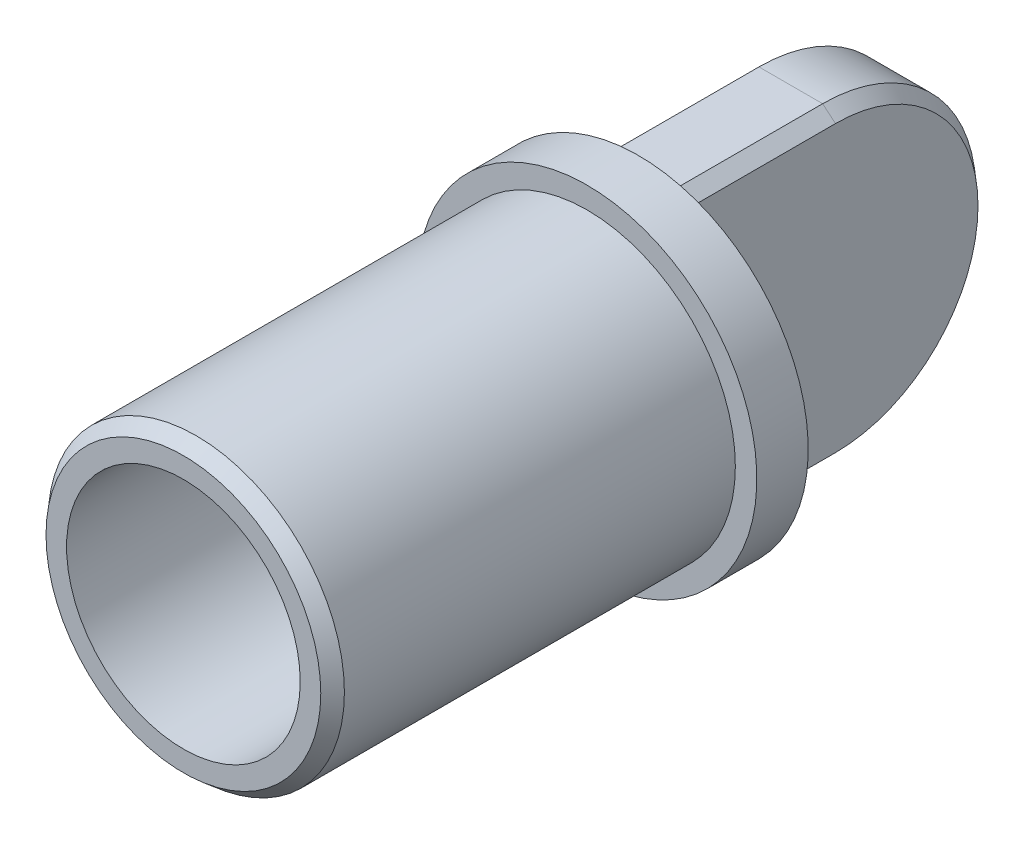
ISO-10303-21;
HEADER;
FILE_DESCRIPTION(('STEP AP214'),'2;1');
FILE_NAME('part.step','',(''),(''),'','','');
FILE_SCHEMA(('AUTOMOTIVE_DESIGN { 1 0 10303 214 1 1 1 1 }'));
ENDSEC;
DATA;
#1=APPLICATION_CONTEXT('core data for automotive mechanical design processes');
#2=APPLICATION_PROTOCOL_DEFINITION('international standard','automotive_design',2000,#1);
#3=PRODUCT_CONTEXT('',#1,'mechanical');
#4=PRODUCT('Part','Part','',(#3));
#5=PRODUCT_RELATED_PRODUCT_CATEGORY('part','',(#4));
#6=PRODUCT_DEFINITION_FORMATION('','',#4);
#7=PRODUCT_DEFINITION_CONTEXT('part definition',#1,'design');
#8=PRODUCT_DEFINITION('design','',#6,#7);
#9=PRODUCT_DEFINITION_SHAPE('','',#8);
#10=(LENGTH_UNIT() NAMED_UNIT(*) SI_UNIT(.MILLI.,.METRE.));
#11=(NAMED_UNIT(*) PLANE_ANGLE_UNIT() SI_UNIT($,.RADIAN.));
#12=(NAMED_UNIT(*) SI_UNIT($,.STERADIAN.) SOLID_ANGLE_UNIT());
#13=UNCERTAINTY_MEASURE_WITH_UNIT(LENGTH_MEASURE(1.E-05),#10,'distance_accuracy_value','');
#14=(GEOMETRIC_REPRESENTATION_CONTEXT(3) GLOBAL_UNCERTAINTY_ASSIGNED_CONTEXT((#13)) GLOBAL_UNIT_ASSIGNED_CONTEXT((#10,
#11,#12)) REPRESENTATION_CONTEXT('',''));
#15=CARTESIAN_POINT('',(0.,0.,0.));
#16=DIRECTION('',(0.,0.,1.));
#17=DIRECTION('',(1.,0.,0.));
#18=AXIS2_PLACEMENT_3D('',#15,#16,#17);
#19=CARTESIAN_POINT('',(0.,0.,30.0829812679553));
#20=DIRECTION('',(0.,0.,-1.));
#21=DIRECTION('',(-1.,0.,0.));
#22=AXIS2_PLACEMENT_3D('',#19,#20,#21);
#23=CYLINDRICAL_SURFACE('',#22,7.32587803050314);
#24=CARTESIAN_POINT('',(0.,0.,29.4479812679553));
#25=DIRECTION('',(0.,0.,1.));
#26=DIRECTION('',(1.,0.,0.));
#27=AXIS2_PLACEMENT_3D('',#24,#25,#26);
#28=CIRCLE('',#27,7.32587803050314);
#29=CARTESIAN_POINT('',(-7.32587803050314,0.,29.4479812679553));
#30=VERTEX_POINT('',#29);
#31=EDGE_CURVE('E11',#30,#30,#28,.F.);
#32=CARTESIAN_POINT('',(0.,0.,10.1185647670471));
#33=DIRECTION('',(0.,0.,-1.));
#34=DIRECTION('',(-1.,0.,0.));
#35=AXIS2_PLACEMENT_3D('',#32,#33,#34);
#36=CIRCLE('',#35,7.32587803050314);
#37=CARTESIAN_POINT('',(-7.32587803050314,0.,10.1185647670471));
#38=VERTEX_POINT('',#37);
#39=EDGE_CURVE('E125',#38,#38,#36,.T.);
#40=CARTESIAN_POINT('',(-7.32587803050314,0.,29.4479812679553));
#41=CARTESIAN_POINT('',(-7.32587803050314,0.,29.2466331794042));
#42=CARTESIAN_POINT('',(-7.32587803050314,0.,29.0452850908531));
#43=CARTESIAN_POINT('',(-7.32587803050314,0.,28.6425889137508));
#44=CARTESIAN_POINT('',(-7.32587803050314,0.,28.4412408251997));
#45=CARTESIAN_POINT('',(-7.32587803050314,0.,28.0385446480974));
#46=CARTESIAN_POINT('',(-7.32587803050314,0.,27.8371965595463));
#47=CARTESIAN_POINT('',(-7.32587803050314,0.,27.434500382444));
#48=CARTESIAN_POINT('',(-7.32587803050314,0.,27.2331522938929));
#49=CARTESIAN_POINT('',(-7.32587803050314,0.,26.8304561167907));
#50=CARTESIAN_POINT('',(-7.32587803050314,0.,26.6291080282395));
#51=CARTESIAN_POINT('',(-7.32587803050314,0.,26.2264118511373));
#52=CARTESIAN_POINT('',(-7.32587803050314,0.,26.0250637625862));
#53=CARTESIAN_POINT('',(-7.32587803050314,0.,25.6223675854839));
#54=CARTESIAN_POINT('',(-7.32587803050314,0.,25.4210194969328));
#55=CARTESIAN_POINT('',(-7.32587803050314,0.,25.0183233198305));
#56=CARTESIAN_POINT('',(-7.32587803050314,0.,24.8169752312794));
#57=CARTESIAN_POINT('',(-7.32587803050314,0.,24.4142790541771));
#58=CARTESIAN_POINT('',(-7.32587803050314,0.,24.212930965626));
#59=CARTESIAN_POINT('',(-7.32587803050314,0.,23.8102347885238));
#60=CARTESIAN_POINT('',(-7.32587803050314,0.,23.6088866999726));
#61=CARTESIAN_POINT('',(-7.32587803050314,0.,23.2061905228704));
#62=CARTESIAN_POINT('',(-7.32587803050314,0.,23.0048424343192));
#63=CARTESIAN_POINT('',(-7.32587803050314,0.,22.602146257217));
#64=CARTESIAN_POINT('',(-7.32587803050314,0.,22.4007981686659));
#65=CARTESIAN_POINT('',(-7.32587803050314,0.,21.9981019915636));
#66=CARTESIAN_POINT('',(-7.32587803050314,0.,21.7967539030125));
#67=CARTESIAN_POINT('',(-7.32587803050314,0.,21.3940577259102));
#68=CARTESIAN_POINT('',(-7.32587803050314,0.,21.1927096373591));
#69=CARTESIAN_POINT('',(-7.32587803050314,0.,20.7900134602568));
#70=CARTESIAN_POINT('',(-7.32587803050314,0.,20.5886653717057));
#71=CARTESIAN_POINT('',(-7.32587803050314,0.,20.1859691946035));
#72=CARTESIAN_POINT('',(-7.32587803050314,0.,19.9846211060523));
#73=CARTESIAN_POINT('',(-7.32587803050314,0.,19.5819249289501));
#74=CARTESIAN_POINT('',(-7.32587803050314,0.,19.3805768403989));
#75=CARTESIAN_POINT('',(-7.32587803050314,0.,18.9778806632967));
#76=CARTESIAN_POINT('',(-7.32587803050314,0.,18.7765325747456));
#77=CARTESIAN_POINT('',(-7.32587803050314,0.,18.3738363976433));
#78=CARTESIAN_POINT('',(-7.32587803050314,0.,18.1724883090922));
#79=CARTESIAN_POINT('',(-7.32587803050314,0.,17.7697921319899));
#80=CARTESIAN_POINT('',(-7.32587803050314,0.,17.5684440434388));
#81=CARTESIAN_POINT('',(-7.32587803050314,0.,17.1657478663365));
#82=CARTESIAN_POINT('',(-7.32587803050314,0.,16.9643997777854));
#83=CARTESIAN_POINT('',(-7.32587803050314,0.,16.5617036006832));
#84=CARTESIAN_POINT('',(-7.32587803050314,0.,16.360355512132));
#85=CARTESIAN_POINT('',(-7.32587803050314,0.,15.9576593350298));
#86=CARTESIAN_POINT('',(-7.32587803050314,0.,15.7563112464786));
#87=CARTESIAN_POINT('',(-7.32587803050314,0.,15.3536150693764));
#88=CARTESIAN_POINT('',(-7.32587803050314,0.,15.1522669808253));
#89=CARTESIAN_POINT('',(-7.32587803050314,0.,14.749570803723));
#90=CARTESIAN_POINT('',(-7.32587803050314,0.,14.5482227151719));
#91=CARTESIAN_POINT('',(-7.32587803050314,0.,14.1455265380696));
#92=CARTESIAN_POINT('',(-7.32587803050314,0.,13.9441784495185));
#93=CARTESIAN_POINT('',(-7.32587803050314,0.,13.5414822724162));
#94=CARTESIAN_POINT('',(-7.32587803050314,0.,13.3401341838651));
#95=CARTESIAN_POINT('',(-7.32587803050314,0.,12.9374380067629));
#96=CARTESIAN_POINT('',(-7.32587803050314,0.,12.7360899182117));
#97=CARTESIAN_POINT('',(-7.32587803050314,0.,12.3333937411095));
#98=CARTESIAN_POINT('',(-7.32587803050314,0.,12.1320456525584));
#99=CARTESIAN_POINT('',(-7.32587803050314,0.,11.7293494754561));
#100=CARTESIAN_POINT('',(-7.32587803050314,0.,11.528001386905));
#101=CARTESIAN_POINT('',(-7.32587803050314,0.,11.1253052098027));
#102=CARTESIAN_POINT('',(-7.32587803050314,0.,10.9239571212516));
#103=CARTESIAN_POINT('',(-7.32587803050314,0.,10.5212609441493));
#104=CARTESIAN_POINT('',(-7.32587803050314,0.,10.3199128555982));
#105=CARTESIAN_POINT('',(-7.32587803050314,0.,10.1185647670471));
#106=B_SPLINE_CURVE_WITH_KNOTS('',3,(#40,#41,#42,#43,#44,#45,#46,#47,#48,#49,#50,#51,#52,#53,
#54,#55,#56,#57,#58,#59,#60,#61,#62,#63,#64,#65,#66,#67,#68,#69,#70,#71,#72,#73,#74,#75,#76,#77,
#78,#79,#80,#81,#82,#83,#84,#85,#86,#87,#88,#89,#90,#91,#92,#93,#94,#95,#96,#97,#98,#99,#100,
#101,#102,#103,#104,#105),.UNSPECIFIED.,.F.,.F.,(4,2,2,2,2,2,2,2,2,2,2,2,2,2,2,2,2,2,2,2,2,2,2,
2,2,2,2,2,2,2,2,2,4),(0.,0.604044265653383,1.20808853130677,1.81213279696015,2.41617706261353,
3.02022132826691,3.6242655939203,4.22830985957368,4.83235412522706,5.43639839088044,
6.04044265653383,6.64448692218721,7.24853118784059,7.85257545349398,8.45661971914736,
9.06066398480074,9.66470825045412,10.2687525161075,10.8727967817609,11.4768410474143,
12.0808853130677,12.684929578721,13.2889738443744,13.8930181100278,14.4970623756812,
15.1011066413346,15.705150906988,16.3091951726413,16.9132394382947,17.5172837039481,
18.1213279696015,18.7253722352549,19.3294165009083),.UNSPECIFIED.);
#107=EDGE_CURVE('BSEAM32',#30,#38,#106,.T.);
#108=ORIENTED_EDGE('',*,*,#31,.T.);
#109=ORIENTED_EDGE('',*,*,#39,.F.);
#110=ORIENTED_EDGE('',*,*,#107,.T.);
#111=ORIENTED_EDGE('',*,*,#107,.F.);
#112=EDGE_LOOP('',(#108,#110,#109,#111));
#113=FACE_BOUND('',#112,.T.);
#114=ADVANCED_FACE('F32',(#113),#23,.T.);
#115=CARTESIAN_POINT('',(0.,0.,30.0829812679553));
#116=DIRECTION('',(0.,0.,1.));
#117=DIRECTION('',(1.,0.,0.));
#118=AXIS2_PLACEMENT_3D('',#115,#116,#117);
#119=PLANE('',#118);
#120=CARTESIAN_POINT('',(0.,0.,30.0829812679553));
#121=DIRECTION('',(0.,0.,1.));
#122=DIRECTION('',(1.,0.,0.));
#123=AXIS2_PLACEMENT_3D('',#120,#121,#122);
#124=CIRCLE('',#123,5.77669234422583);
#125=CARTESIAN_POINT('',(5.77669234422583,0.,30.0829812679553));
#126=VERTEX_POINT('',#125);
#127=EDGE_CURVE('E134',#126,#126,#124,.T.);
#128=ORIENTED_EDGE('',*,*,#127,.F.);
#129=EDGE_LOOP('',(#128));
#130=FACE_BOUND('',#129,.T.);
#131=CARTESIAN_POINT('',(0.,0.,30.0829812679553));
#132=DIRECTION('',(0.,0.,1.));
#133=DIRECTION('',(1.,0.,0.));
#134=AXIS2_PLACEMENT_3D('',#131,#132,#133);
#135=CIRCLE('',#134,6.79304976470559);
#136=CARTESIAN_POINT('',(6.79304976470559,0.,30.0829812679553));
#137=VERTEX_POINT('',#136);
#138=EDGE_CURVE('E40',#137,#137,#135,.T.);
#139=ORIENTED_EDGE('',*,*,#138,.T.);
#140=EDGE_LOOP('',(#139));
#141=FACE_BOUND('',#140,.T.);
#142=ADVANCED_FACE('F226',(#130,#141),#119,.T.);
#143=CARTESIAN_POINT('',(0.,0.,10.1185647670471));
#144=DIRECTION('',(0.,0.,-1.));
#145=DIRECTION('',(-1.,0.,0.));
#146=AXIS2_PLACEMENT_3D('',#143,#144,#145);
#147=PLANE('',#146);
#148=CARTESIAN_POINT('',(0.,0.,10.1185647670471));
#149=DIRECTION('',(0.,0.,-1.));
#150=DIRECTION('',(-1.,0.,0.));
#151=AXIS2_PLACEMENT_3D('',#148,#149,#150);
#152=CIRCLE('',#151,8.3882325631305);
#153=CARTESIAN_POINT('',(-8.3882325631305,0.,10.1185647670471));
#154=VERTEX_POINT('',#153);
#155=EDGE_CURVE('E162',#154,#154,#152,.T.);
#156=ORIENTED_EDGE('',*,*,#155,.F.);
#157=EDGE_LOOP('',(#156));
#158=FACE_BOUND('',#157,.T.);
#159=ORIENTED_EDGE('',*,*,#39,.T.);
#160=EDGE_LOOP('',(#159));
#161=FACE_BOUND('',#160,.T.);
#162=ADVANCED_FACE('F232',(#158,#161),#147,.F.);
#163=CARTESIAN_POINT('',(0.,0.,10.1185647670471));
#164=DIRECTION('',(0.,0.,-1.));
#165=DIRECTION('',(-1.,0.,0.));
#166=AXIS2_PLACEMENT_3D('',#163,#164,#165);
#167=CYLINDRICAL_SURFACE('',#166,8.3882325631305);
#168=ORIENTED_EDGE('',*,*,#155,.T.);
#169=EDGE_LOOP('',(#168));
#170=FACE_BOUND('',#169,.T.);
#171=CARTESIAN_POINT('',(0.,0.,7.57856476704706));
#172=DIRECTION('',(0.,0.,-1.));
#173=DIRECTION('',(-1.,0.,0.));
#174=AXIS2_PLACEMENT_3D('',#171,#172,#173);
#175=CIRCLE('',#174,8.3882325631305);
#176=CARTESIAN_POINT('',(-8.3882325631305,0.,7.57856476704706));
#177=VERTEX_POINT('',#176);
#178=EDGE_CURVE('E157',#177,#177,#175,.T.);
#179=ORIENTED_EDGE('',*,*,#178,.F.);
#180=EDGE_LOOP('',(#179));
#181=FACE_BOUND('',#180,.T.);
#182=ADVANCED_FACE('F324',(#170,#181),#167,.T.);
#183=CARTESIAN_POINT('',(2.159,0.,0.));
#184=DIRECTION('',(-1.,0.,0.));
#185=DIRECTION('',(0.,0.,1.));
#186=AXIS2_PLACEMENT_3D('',#183,#184,#185);
#187=CYLINDRICAL_SURFACE('',#186,7.57856476704707);
#188=DIRECTION('',(-1.,0.,0.));
#189=VECTOR('',#188,1.);
#190=CARTESIAN_POINT('',(2.159,-7.57856476704707,0.));
#191=LINE('',#190,#189);
#192=CARTESIAN_POINT('',(1.524,-7.57856476704707,0.));
#193=VERTEX_POINT('',#192);
#194=CARTESIAN_POINT('',(-1.62617173420243,-7.57856476704707,0.));
#195=VERTEX_POINT('',#194);
#196=EDGE_CURVE('E103',#193,#195,#191,.T.);
#197=ORIENTED_EDGE('',*,*,#196,.T.);
#198=CARTESIAN_POINT('',(-1.62617173420243,0.,0.));
#199=DIRECTION('',(1.,0.,0.));
#200=DIRECTION('',(0.,0.,-1.));
#201=AXIS2_PLACEMENT_3D('',#198,#199,#200);
#202=CIRCLE('',#201,7.57856476704707);
#203=CARTESIAN_POINT('',(-1.62617173420243,7.57856476704707,0.));
#204=VERTEX_POINT('',#203);
#205=EDGE_CURVE('E109',#195,#204,#202,.T.);
#206=ORIENTED_EDGE('',*,*,#205,.T.);
#207=DIRECTION('',(-1.,0.,0.));
#208=VECTOR('',#207,1.);
#209=CARTESIAN_POINT('',(2.159,7.57856476704707,0.));
#210=LINE('',#209,#208);
#211=CARTESIAN_POINT('',(1.524,7.57856476704707,0.));
#212=VERTEX_POINT('',#211);
#213=EDGE_CURVE('E105',#212,#204,#210,.T.);
#214=ORIENTED_EDGE('',*,*,#213,.F.);
#215=CARTESIAN_POINT('',(1.524,0.,0.));
#216=DIRECTION('',(1.,0.,0.));
#217=DIRECTION('',(0.,0.,-1.));
#218=AXIS2_PLACEMENT_3D('',#215,#216,#217);
#219=CIRCLE('',#218,7.57856476704707);
#220=EDGE_CURVE('E100',#212,#193,#219,.F.);
#221=ORIENTED_EDGE('',*,*,#220,.T.);
#222=EDGE_LOOP('',(#197,#206,#214,#221));
#223=FACE_BOUND('',#222,.T.);
#224=ADVANCED_FACE('F102',(#223),#187,.T.);
#225=CARTESIAN_POINT('',(2.159,0.,-16.8142638437409));
#226=DIRECTION('',(1.,0.,0.));
#227=DIRECTION('',(0.,0.,-1.));
#228=AXIS2_PLACEMENT_3D('',#225,#226,#227);
#229=PLANE('',#228);
#230=DIRECTION('',(0.,-1.,0.));
#231=VECTOR('',#230,1.);
#232=CARTESIAN_POINT('',(2.159,0.,7.57856476704706));
#233=LINE('',#232,#231);
#234=CARTESIAN_POINT('',(2.159,7.04573650124949,7.57856476704706));
#235=VERTEX_POINT('',#234);
#236=CARTESIAN_POINT('',(2.159,-7.04573650124949,7.57856476704706));
#237=VERTEX_POINT('',#236);
#238=EDGE_CURVE('E170',#235,#237,#233,.T.);
#239=ORIENTED_EDGE('',*,*,#238,.T.);
#240=DIRECTION('',(0.,0.,-1.));
#241=VECTOR('',#240,1.);
#242=CARTESIAN_POINT('',(2.159,-7.04573650124949,0.));
#243=LINE('',#242,#241);
#244=CARTESIAN_POINT('',(2.159,-7.04573650124949,0.));
#245=VERTEX_POINT('',#244);
#246=EDGE_CURVE('E195',#237,#245,#243,.T.);
#247=ORIENTED_EDGE('',*,*,#246,.T.);
#248=CARTESIAN_POINT('',(2.159,0.,0.));
#249=DIRECTION('',(1.,0.,0.));
#250=DIRECTION('',(0.,0.,-1.));
#251=AXIS2_PLACEMENT_3D('',#248,#249,#250);
#252=CIRCLE('',#251,7.04573650124949);
#253=CARTESIAN_POINT('',(2.159,7.04573650124949,0.));
#254=VERTEX_POINT('',#253);
#255=EDGE_CURVE('E54',#245,#254,#252,.T.);
#256=ORIENTED_EDGE('',*,*,#255,.T.);
#257=DIRECTION('',(0.,0.,1.));
#258=VECTOR('',#257,1.);
#259=CARTESIAN_POINT('',(2.159,7.04573650124949,7.57856476704706));
#260=LINE('',#259,#258);
#261=EDGE_CURVE('E192',#254,#235,#260,.T.);
#262=ORIENTED_EDGE('',*,*,#261,.T.);
#263=EDGE_LOOP('',(#239,#247,#256,#262));
#264=FACE_BOUND('',#263,.T.);
#265=ADVANCED_FACE('F210',(#264),#229,.T.);
#266=CARTESIAN_POINT('',(-2.159,0.,-16.8142638437409));
#267=DIRECTION('',(1.,0.,0.));
#268=DIRECTION('',(0.,0.,-1.));
#269=AXIS2_PLACEMENT_3D('',#266,#267,#268);
#270=PLANE('',#269);
#271=CARTESIAN_POINT('',(-2.159,0.,0.));
#272=DIRECTION('',(1.,0.,0.));
#273=DIRECTION('',(0.,0.,-1.));
#274=AXIS2_PLACEMENT_3D('',#271,#272,#273);
#275=CIRCLE('',#274,6.94356476704706);
#276=CARTESIAN_POINT('',(-2.159,6.94356476704706,0.));
#277=VERTEX_POINT('',#276);
#278=CARTESIAN_POINT('',(-2.159,-6.94356476704706,0.));
#279=VERTEX_POINT('',#278);
#280=EDGE_CURVE('E184',#277,#279,#275,.F.);
#281=ORIENTED_EDGE('',*,*,#280,.T.);
#282=DIRECTION('',(0.,0.,1.));
#283=VECTOR('',#282,1.);
#284=CARTESIAN_POINT('',(-2.159,-6.94356476704706,-16.8142638437409));
#285=LINE('',#284,#283);
#286=CARTESIAN_POINT('',(-2.159,-6.94356476704706,7.57856476704706));
#287=VERTEX_POINT('',#286);
#288=EDGE_CURVE('E110',#279,#287,#285,.T.);
#289=ORIENTED_EDGE('',*,*,#288,.T.);
#290=DIRECTION('',(0.,-1.,0.));
#291=VECTOR('',#290,1.);
#292=CARTESIAN_POINT('',(-2.159,0.,7.57856476704706));
#293=LINE('',#292,#291);
#294=CARTESIAN_POINT('',(-2.159,6.94356476704706,7.57856476704706));
#295=VERTEX_POINT('',#294);
#296=EDGE_CURVE('E173',#295,#287,#293,.T.);
#297=ORIENTED_EDGE('',*,*,#296,.F.);
#298=DIRECTION('',(0.,0.,-1.));
#299=VECTOR('',#298,1.);
#300=CARTESIAN_POINT('',(-2.159,6.94356476704706,-16.8142638437409));
#301=LINE('',#300,#299);
#302=EDGE_CURVE('E182',#295,#277,#301,.T.);
#303=ORIENTED_EDGE('',*,*,#302,.T.);
#304=EDGE_LOOP('',(#281,#289,#297,#303));
#305=FACE_BOUND('',#304,.T.);
#306=ADVANCED_FACE('F206',(#305),#270,.F.);
#307=CARTESIAN_POINT('',(2.159,7.57856476704707,-16.8142638437409));
#308=DIRECTION('',(0.,-1.,0.));
#309=DIRECTION('',(0.,0.,-1.));
#310=AXIS2_PLACEMENT_3D('',#307,#308,#309);
#311=PLANE('',#310);
#312=ORIENTED_EDGE('',*,*,#213,.T.);
#313=DIRECTION('',(0.,0.,1.));
#314=VECTOR('',#313,1.);
#315=CARTESIAN_POINT('',(-1.62617173420243,7.57856476704707,-16.8142638437409));
#316=LINE('',#315,#314);
#317=CARTESIAN_POINT('',(-1.62617173420243,7.57856476704707,7.57856476704706));
#318=VERTEX_POINT('',#317);
#319=EDGE_CURVE('E190',#204,#318,#316,.T.);
#320=ORIENTED_EDGE('',*,*,#319,.T.);
#321=DIRECTION('',(-1.,0.,0.));
#322=VECTOR('',#321,1.);
#323=CARTESIAN_POINT('',(2.159,7.57856476704707,7.57856476704706));
#324=LINE('',#323,#322);
#325=CARTESIAN_POINT('',(1.524,7.57856476704707,7.57856476704706));
#326=VERTEX_POINT('',#325);
#327=EDGE_CURVE('E167',#326,#318,#324,.T.);
#328=ORIENTED_EDGE('',*,*,#327,.F.);
#329=DIRECTION('',(0.,0.,-1.));
#330=VECTOR('',#329,1.);
#331=CARTESIAN_POINT('',(1.524,7.57856476704707,0.));
#332=LINE('',#331,#330);
#333=EDGE_CURVE('E188',#326,#212,#332,.T.);
#334=ORIENTED_EDGE('',*,*,#333,.T.);
#335=EDGE_LOOP('',(#312,#320,#328,#334));
#336=FACE_BOUND('',#335,.T.);
#337=ADVANCED_FACE('F215',(#336),#311,.F.);
#338=CARTESIAN_POINT('',(2.159,-7.57856476704707,-16.8142638437409));
#339=DIRECTION('',(0.,1.,0.));
#340=DIRECTION('',(0.,0.,1.));
#341=AXIS2_PLACEMENT_3D('',#338,#339,#340);
#342=PLANE('',#341);
#343=DIRECTION('',(-1.,0.,0.));
#344=VECTOR('',#343,1.);
#345=CARTESIAN_POINT('',(2.159,-7.57856476704707,7.57856476704706));
#346=LINE('',#345,#344);
#347=CARTESIAN_POINT('',(1.524,-7.57856476704707,7.57856476704706));
#348=VERTEX_POINT('',#347);
#349=CARTESIAN_POINT('',(-1.62617173420243,-7.57856476704707,7.57856476704706));
#350=VERTEX_POINT('',#349);
#351=EDGE_CURVE('E120',#348,#350,#346,.T.);
#352=ORIENTED_EDGE('',*,*,#351,.T.);
#353=DIRECTION('',(0.,0.,-1.));
#354=VECTOR('',#353,1.);
#355=CARTESIAN_POINT('',(-1.62617173420243,-7.57856476704707,-16.8142638437409));
#356=LINE('',#355,#354);
#357=EDGE_CURVE('E119',#350,#195,#356,.T.);
#358=ORIENTED_EDGE('',*,*,#357,.T.);
#359=ORIENTED_EDGE('',*,*,#196,.F.);
#360=DIRECTION('',(0.,0.,1.));
#361=VECTOR('',#360,1.);
#362=CARTESIAN_POINT('',(1.524,-7.57856476704707,7.57856476704706));
#363=LINE('',#362,#361);
#364=EDGE_CURVE('E116',#193,#348,#363,.T.);
#365=ORIENTED_EDGE('',*,*,#364,.T.);
#366=EDGE_LOOP('',(#352,#358,#359,#365));
#367=FACE_BOUND('',#366,.T.);
#368=ADVANCED_FACE('F115',(#367),#342,.F.);
#369=CARTESIAN_POINT('',(-7.32587803050314,0.,7.57856476704706));
#370=DIRECTION('',(0.,0.,1.));
#371=DIRECTION('',(1.,0.,0.));
#372=AXIS2_PLACEMENT_3D('',#369,#370,#371);
#373=PLANE('',#372);
#374=ORIENTED_EDGE('',*,*,#327,.T.);
#375=DIRECTION('',(0.642787609686538,0.766044443118979,0.));
#376=VECTOR('',#375,1.);
#377=CARTESIAN_POINT('',(-7.71286774620465,0.324722927714542,7.57856476704706));
#378=LINE('',#377,#376);
#379=EDGE_CURVE('E149',#318,#295,#378,.F.);
#380=ORIENTED_EDGE('',*,*,#379,.T.);
#381=ORIENTED_EDGE('',*,*,#296,.T.);
#382=DIRECTION('',(-0.642787609686538,0.766044443118979,0.));
#383=VECTOR('',#382,1.);
#384=CARTESIAN_POINT('',(-7.71286774620465,-0.324722927714541,7.57856476704706));
#385=LINE('',#384,#383);
#386=EDGE_CURVE('E197',#287,#350,#385,.F.);
#387=ORIENTED_EDGE('',*,*,#386,.T.);
#388=ORIENTED_EDGE('',*,*,#351,.F.);
#389=DIRECTION('',(0.766044443118979,0.642787609686538,0.));
#390=VECTOR('',#389,1.);
#391=CARTESIAN_POINT('',(0.0623930581092336,-8.80499861291376,7.57856476704706));
#392=LINE('',#391,#390);
#393=EDGE_CURVE('E124',#348,#237,#392,.T.);
#394=ORIENTED_EDGE('',*,*,#393,.T.);
#395=ORIENTED_EDGE('',*,*,#238,.F.);
#396=DIRECTION('',(-0.766044443118979,0.642787609686538,0.));
#397=VECTOR('',#396,1.);
#398=CARTESIAN_POINT('',(0.0623930581092327,8.80499861291375,7.57856476704706));
#399=LINE('',#398,#397);
#400=EDGE_CURVE('E140',#235,#326,#399,.T.);
#401=ORIENTED_EDGE('',*,*,#400,.T.);
#402=EDGE_LOOP('',(#374,#380,#381,#387,#388,#394,#395,#401));
#403=FACE_BOUND('',#402,.T.);
#404=ORIENTED_EDGE('',*,*,#178,.T.);
#405=EDGE_LOOP('',(#404));
#406=FACE_BOUND('',#405,.T.);
#407=ADVANCED_FACE('F200',(#403,#406),#373,.F.);
#408=CARTESIAN_POINT('',(-1.62617173420243,7.57856476704707,-16.8142638437409));
#409=DIRECTION('',(0.766044443118979,-0.642787609686538,0.));
#410=DIRECTION('',(0.642787609686538,0.766044443118979,0.));
#411=AXIS2_PLACEMENT_3D('',#408,#409,#410);
#412=PLANE('',#411);
#413=ORIENTED_EDGE('',*,*,#379,.F.);
#414=ORIENTED_EDGE('',*,*,#319,.F.);
#415=DIRECTION('',(0.642787609686538,0.766044443118979,0.));
#416=VECTOR('',#415,1.);
#417=CARTESIAN_POINT('',(-2.159,6.94356476704706,0.));
#418=LINE('',#417,#416);
#419=EDGE_CURVE('E137',#277,#204,#418,.T.);
#420=ORIENTED_EDGE('',*,*,#419,.F.);
#421=ORIENTED_EDGE('',*,*,#302,.F.);
#422=EDGE_LOOP('',(#413,#414,#420,#421));
#423=FACE_BOUND('',#422,.T.);
#424=ADVANCED_FACE('F207',(#423),#412,.F.);
#425=CARTESIAN_POINT('',(-1.62617173420243,0.,0.));
#426=DIRECTION('',(1.,0.,0.));
#427=DIRECTION('',(0.,0.,-1.));
#428=AXIS2_PLACEMENT_3D('',#425,#426,#427);
#429=CONICAL_SURFACE('',#428,7.57856476704707,0.872664625997166);
#430=ORIENTED_EDGE('',*,*,#419,.T.);
#431=ORIENTED_EDGE('',*,*,#205,.F.);
#432=DIRECTION('',(0.642787609686538,-0.766044443118979,0.));
#433=VECTOR('',#432,1.);
#434=CARTESIAN_POINT('',(-2.159,-6.94356476704706,0.));
#435=LINE('',#434,#433);
#436=EDGE_CURVE('E131',#279,#195,#435,.T.);
#437=ORIENTED_EDGE('',*,*,#436,.F.);
#438=ORIENTED_EDGE('',*,*,#280,.F.);
#439=EDGE_LOOP('',(#430,#431,#437,#438));
#440=FACE_BOUND('',#439,.T.);
#441=ADVANCED_FACE('F208',(#440),#429,.T.);
#442=CARTESIAN_POINT('',(-1.62617173420243,-7.57856476704707,-16.8142638437409));
#443=DIRECTION('',(0.766044443118979,0.642787609686538,0.));
#444=DIRECTION('',(-0.642787609686538,0.766044443118979,0.));
#445=AXIS2_PLACEMENT_3D('',#442,#443,#444);
#446=PLANE('',#445);
#447=ORIENTED_EDGE('',*,*,#386,.F.);
#448=ORIENTED_EDGE('',*,*,#288,.F.);
#449=ORIENTED_EDGE('',*,*,#436,.T.);
#450=ORIENTED_EDGE('',*,*,#357,.F.);
#451=EDGE_LOOP('',(#447,#448,#449,#450));
#452=FACE_BOUND('',#451,.T.);
#453=ADVANCED_FACE('F209',(#452),#446,.F.);
#454=CARTESIAN_POINT('',(2.159,7.04573650124949,-16.8142638437409));
#455=DIRECTION('',(0.642787609686538,0.766044443118979,0.));
#456=DIRECTION('',(-0.766044443118979,0.642787609686538,0.));
#457=AXIS2_PLACEMENT_3D('',#454,#455,#456);
#458=PLANE('',#457);
#459=ORIENTED_EDGE('',*,*,#400,.F.);
#460=ORIENTED_EDGE('',*,*,#261,.F.);
#461=DIRECTION('',(0.766044443118979,-0.642787609686538,0.));
#462=VECTOR('',#461,1.);
#463=CARTESIAN_POINT('',(1.524,7.57856476704707,0.));
#464=LINE('',#463,#462);
#465=EDGE_CURVE('E128',#212,#254,#464,.T.);
#466=ORIENTED_EDGE('',*,*,#465,.F.);
#467=ORIENTED_EDGE('',*,*,#333,.F.);
#468=EDGE_LOOP('',(#459,#460,#466,#467));
#469=FACE_BOUND('',#468,.T.);
#470=ADVANCED_FACE('F212',(#469),#458,.T.);
#471=CARTESIAN_POINT('',(2.159,0.,0.));
#472=DIRECTION('',(-1.,0.,0.));
#473=DIRECTION('',(0.,0.,1.));
#474=AXIS2_PLACEMENT_3D('',#471,#472,#473);
#475=CONICAL_SURFACE('',#474,7.04573650124949,0.69813170079773);
#476=ORIENTED_EDGE('',*,*,#465,.T.);
#477=ORIENTED_EDGE('',*,*,#255,.F.);
#478=DIRECTION('',(0.766044443118979,0.642787609686538,0.));
#479=VECTOR('',#478,1.);
#480=CARTESIAN_POINT('',(1.524,-7.57856476704707,0.));
#481=LINE('',#480,#479);
#482=EDGE_CURVE('E47',#193,#245,#481,.T.);
#483=ORIENTED_EDGE('',*,*,#482,.F.);
#484=ORIENTED_EDGE('',*,*,#220,.F.);
#485=EDGE_LOOP('',(#476,#477,#483,#484));
#486=FACE_BOUND('',#485,.T.);
#487=ADVANCED_FACE('F127',(#486),#475,.T.);
#488=CARTESIAN_POINT('',(2.159,-7.04573650124949,-16.8142638437409));
#489=DIRECTION('',(0.642787609686538,-0.766044443118979,0.));
#490=DIRECTION('',(0.766044443118979,0.642787609686538,0.));
#491=AXIS2_PLACEMENT_3D('',#488,#489,#490);
#492=PLANE('',#491);
#493=ORIENTED_EDGE('',*,*,#393,.F.);
#494=ORIENTED_EDGE('',*,*,#364,.F.);
#495=ORIENTED_EDGE('',*,*,#482,.T.);
#496=ORIENTED_EDGE('',*,*,#246,.F.);
#497=EDGE_LOOP('',(#493,#494,#495,#496));
#498=FACE_BOUND('',#497,.T.);
#499=ADVANCED_FACE('F123',(#498),#492,.T.);
#500=CARTESIAN_POINT('',(0.,0.,30.0829812679553));
#501=DIRECTION('',(0.,0.,-1.));
#502=DIRECTION('',(-1.,0.,0.));
#503=AXIS2_PLACEMENT_3D('',#500,#501,#502);
#504=CONICAL_SURFACE('',#503,6.79304976470559,0.69813170079773);
#505=ORIENTED_EDGE('',*,*,#31,.F.);
#506=EDGE_LOOP('',(#505));
#507=FACE_BOUND('',#506,.T.);
#508=ORIENTED_EDGE('',*,*,#138,.F.);
#509=EDGE_LOOP('',(#508));
#510=FACE_BOUND('',#509,.T.);
#511=ADVANCED_FACE('F34',(#507,#510),#504,.T.);
#512=CARTESIAN_POINT('',(0.,0.,10.1185647670471));
#513=DIRECTION('',(0.,0.,-1.));
#514=DIRECTION('',(-1.,0.,0.));
#515=AXIS2_PLACEMENT_3D('',#512,#513,#514);
#516=PLANE('',#515);
#517=CARTESIAN_POINT('',(0.,0.,10.1185647670471));
#518=DIRECTION('',(0.,0.,-1.));
#519=DIRECTION('',(-1.,0.,0.));
#520=AXIS2_PLACEMENT_3D('',#517,#518,#519);
#521=CIRCLE('',#520,5.77669234422583);
#522=CARTESIAN_POINT('',(-5.77669234422583,0.,10.1185647670471));
#523=VERTEX_POINT('',#522);
#524=EDGE_CURVE('E129',#523,#523,#521,.F.);
#525=ORIENTED_EDGE('',*,*,#524,.T.);
#526=EDGE_LOOP('',(#525));
#527=FACE_BOUND('',#526,.T.);
#528=ADVANCED_FACE('F266',(#527),#516,.F.);
#529=CARTESIAN_POINT('',(0.,0.,-6.22038855067493));
#530=DIRECTION('',(0.,0.,1.));
#531=DIRECTION('',(1.,0.,0.));
#532=AXIS2_PLACEMENT_3D('',#529,#530,#531);
#533=CYLINDRICAL_SURFACE('',#532,5.77669234422583);
#534=ORIENTED_EDGE('',*,*,#127,.T.);
#535=EDGE_LOOP('',(#534));
#536=FACE_BOUND('',#535,.T.);
#537=ORIENTED_EDGE('',*,*,#524,.F.);
#538=EDGE_LOOP('',(#537));
#539=FACE_BOUND('',#538,.T.);
#540=ADVANCED_FACE('F274',(#536,#539),#533,.F.);
#541=CLOSED_SHELL('',(#114,#142,#162,#182,#224,#265,#306,#337,#368,#407,#424,#441,#453,#470,
#487,#499,#511,#528,#540));
#542=MANIFOLD_SOLID_BREP('B2',#541);
#543=ADVANCED_BREP_SHAPE_REPRESENTATION('',(#18,#542),#14);
#544=SHAPE_DEFINITION_REPRESENTATION(#9,#543);
ENDSEC;
END-ISO-10303-21;
